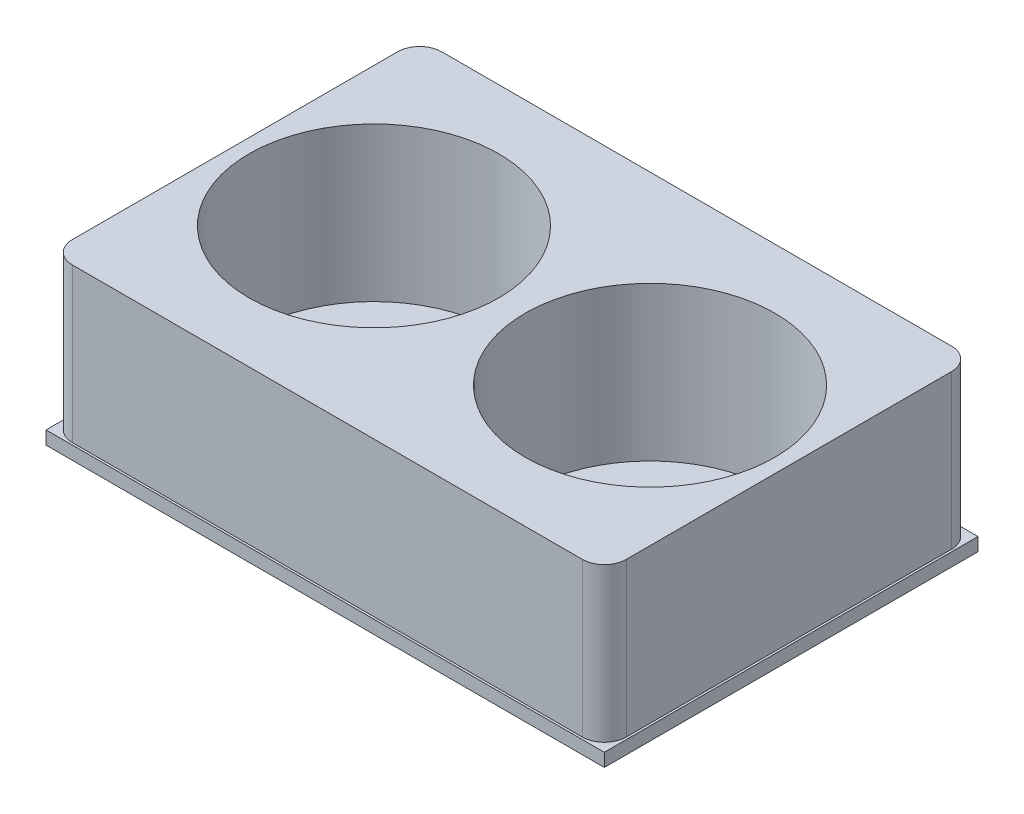
ISO-10303-21;
HEADER;
FILE_DESCRIPTION(('STEP AP214'),'2;1');
FILE_NAME('part.step','',(''),(''),'','','');
FILE_SCHEMA(('AUTOMOTIVE_DESIGN { 1 0 10303 214 1 1 1 1 }'));
ENDSEC;
DATA;
#1=APPLICATION_CONTEXT('core data for automotive mechanical design processes');
#2=APPLICATION_PROTOCOL_DEFINITION('international standard','automotive_design',2000,#1);
#3=PRODUCT_CONTEXT('',#1,'mechanical');
#4=PRODUCT('Part','Part','',(#3));
#5=PRODUCT_RELATED_PRODUCT_CATEGORY('part','',(#4));
#6=PRODUCT_DEFINITION_FORMATION('','',#4);
#7=PRODUCT_DEFINITION_CONTEXT('part definition',#1,'design');
#8=PRODUCT_DEFINITION('design','',#6,#7);
#9=PRODUCT_DEFINITION_SHAPE('','',#8);
#10=(LENGTH_UNIT() NAMED_UNIT(*) SI_UNIT(.MILLI.,.METRE.));
#11=(NAMED_UNIT(*) PLANE_ANGLE_UNIT() SI_UNIT($,.RADIAN.));
#12=(NAMED_UNIT(*) SI_UNIT($,.STERADIAN.) SOLID_ANGLE_UNIT());
#13=UNCERTAINTY_MEASURE_WITH_UNIT(LENGTH_MEASURE(1.E-05),#10,'distance_accuracy_value','');
#14=(GEOMETRIC_REPRESENTATION_CONTEXT(3) GLOBAL_UNCERTAINTY_ASSIGNED_CONTEXT((#13)) GLOBAL_UNIT_ASSIGNED_CONTEXT((#10,
#11,#12)) REPRESENTATION_CONTEXT('',''));
#15=CARTESIAN_POINT('',(0.,0.,0.));
#16=DIRECTION('',(0.,0.,1.));
#17=DIRECTION('',(1.,0.,0.));
#18=AXIS2_PLACEMENT_3D('',#15,#16,#17);
#19=CARTESIAN_POINT('',(0.,35.,0.));
#20=DIRECTION('',(0.,-1.,0.));
#21=DIRECTION('',(0.,0.,-1.));
#22=AXIS2_PLACEMENT_3D('',#19,#20,#21);
#23=PLANE('',#22);
#24=DIRECTION('',(-1.,0.,0.));
#25=VECTOR('',#24,1.);
#26=CARTESIAN_POINT('',(0.,35.,-84.));
#27=LINE('',#26,#25);
#28=CARTESIAN_POINT('',(121.,35.,-84.));
#29=VERTEX_POINT('',#28);
#30=CARTESIAN_POINT('',(5.,35.,-84.));
#31=VERTEX_POINT('',#30);
#32=EDGE_CURVE('E189',#29,#31,#27,.T.);
#33=ORIENTED_EDGE('',*,*,#32,.T.);
#34=CARTESIAN_POINT('',(5.,35.,-79.));
#35=DIRECTION('',(0.,-1.,0.));
#36=DIRECTION('',(0.,0.,-1.));
#37=AXIS2_PLACEMENT_3D('',#34,#35,#36);
#38=CIRCLE('',#37,5.);
#39=CARTESIAN_POINT('',(0.,35.,-79.));
#40=VERTEX_POINT('',#39);
#41=EDGE_CURVE('E217',#31,#40,#38,.F.);
#42=ORIENTED_EDGE('',*,*,#41,.T.);
#43=DIRECTION('',(0.,0.,1.));
#44=VECTOR('',#43,1.);
#45=CARTESIAN_POINT('',(0.,35.,0.));
#46=LINE('',#45,#44);
#47=CARTESIAN_POINT('',(0.,35.,-5.));
#48=VERTEX_POINT('',#47);
#49=EDGE_CURVE('E179',#40,#48,#46,.T.);
#50=ORIENTED_EDGE('',*,*,#49,.T.);
#51=CARTESIAN_POINT('',(5.,35.,-5.));
#52=DIRECTION('',(0.,-1.,0.));
#53=DIRECTION('',(0.,0.,-1.));
#54=AXIS2_PLACEMENT_3D('',#51,#52,#53);
#55=CIRCLE('',#54,5.);
#56=CARTESIAN_POINT('',(5.,35.,0.));
#57=VERTEX_POINT('',#56);
#58=EDGE_CURVE('E211',#48,#57,#55,.F.);
#59=ORIENTED_EDGE('',*,*,#58,.T.);
#60=DIRECTION('',(1.,0.,0.));
#61=VECTOR('',#60,1.);
#62=CARTESIAN_POINT('',(0.,35.,0.));
#63=LINE('',#62,#61);
#64=CARTESIAN_POINT('',(121.,35.,0.));
#65=VERTEX_POINT('',#64);
#66=EDGE_CURVE('E182',#57,#65,#63,.T.);
#67=ORIENTED_EDGE('',*,*,#66,.T.);
#68=CARTESIAN_POINT('',(121.,35.,-5.));
#69=DIRECTION('',(0.,-1.,0.));
#70=DIRECTION('',(0.,0.,-1.));
#71=AXIS2_PLACEMENT_3D('',#68,#69,#70);
#72=CIRCLE('',#71,5.);
#73=CARTESIAN_POINT('',(126.,35.,-5.));
#74=VERTEX_POINT('',#73);
#75=EDGE_CURVE('E213',#65,#74,#72,.F.);
#76=ORIENTED_EDGE('',*,*,#75,.T.);
#77=DIRECTION('',(0.,0.,-1.));
#78=VECTOR('',#77,1.);
#79=CARTESIAN_POINT('',(126.,35.,0.));
#80=LINE('',#79,#78);
#81=CARTESIAN_POINT('',(126.,35.,-79.));
#82=VERTEX_POINT('',#81);
#83=EDGE_CURVE('E186',#74,#82,#80,.T.);
#84=ORIENTED_EDGE('',*,*,#83,.T.);
#85=CARTESIAN_POINT('',(121.,35.,-79.));
#86=DIRECTION('',(0.,-1.,0.));
#87=DIRECTION('',(0.,0.,-1.));
#88=AXIS2_PLACEMENT_3D('',#85,#86,#87);
#89=CIRCLE('',#88,5.);
#90=EDGE_CURVE('E215',#82,#29,#89,.F.);
#91=ORIENTED_EDGE('',*,*,#90,.T.);
#92=EDGE_LOOP('',(#33,#42,#50,#59,#67,#76,#84,#91));
#93=FACE_BOUND('',#92,.T.);
#94=CARTESIAN_POINT('',(31.6,35.,-42.));
#95=DIRECTION('',(0.,1.,0.));
#96=DIRECTION('',(0.,0.,1.));
#97=AXIS2_PLACEMENT_3D('',#94,#95,#96);
#98=CIRCLE('',#97,28.4);
#99=CARTESIAN_POINT('',(31.6,35.,-13.6));
#100=VERTEX_POINT('',#99);
#101=EDGE_CURVE('E173',#100,#100,#98,.T.);
#102=ORIENTED_EDGE('',*,*,#101,.F.);
#103=EDGE_LOOP('',(#102));
#104=FACE_BOUND('',#103,.T.);
#105=CARTESIAN_POINT('',(94.4,35.,-42.));
#106=DIRECTION('',(0.,1.,0.));
#107=DIRECTION('',(0.,0.,1.));
#108=AXIS2_PLACEMENT_3D('',#105,#106,#107);
#109=CIRCLE('',#108,28.4);
#110=CARTESIAN_POINT('',(94.4,35.,-13.6));
#111=VERTEX_POINT('',#110);
#112=EDGE_CURVE('E167',#111,#111,#109,.T.);
#113=ORIENTED_EDGE('',*,*,#112,.F.);
#114=EDGE_LOOP('',(#113));
#115=FACE_BOUND('',#114,.T.);
#116=ADVANCED_FACE('F36',(#93,#104,#115),#23,.F.);
#117=CARTESIAN_POINT('',(0.,35.,0.));
#118=DIRECTION('',(1.,0.,0.));
#119=DIRECTION('',(0.,0.,-1.));
#120=AXIS2_PLACEMENT_3D('',#117,#118,#119);
#121=PLANE('',#120);
#122=ORIENTED_EDGE('',*,*,#49,.F.);
#123=DIRECTION('',(0.,-1.,0.));
#124=VECTOR('',#123,1.);
#125=CARTESIAN_POINT('',(0.,35.,-79.));
#126=LINE('',#125,#124);
#127=CARTESIAN_POINT('',(0.,0.,-79.));
#128=VERTEX_POINT('',#127);
#129=EDGE_CURVE('E203',#40,#128,#126,.T.);
#130=ORIENTED_EDGE('',*,*,#129,.T.);
#131=DIRECTION('',(0.,0.,1.));
#132=VECTOR('',#131,1.);
#133=CARTESIAN_POINT('',(0.,0.,0.));
#134=LINE('',#133,#132);
#135=CARTESIAN_POINT('',(0.,0.,-5.));
#136=VERTEX_POINT('',#135);
#137=EDGE_CURVE('E176',#128,#136,#134,.T.);
#138=ORIENTED_EDGE('',*,*,#137,.T.);
#139=DIRECTION('',(0.,-1.,0.));
#140=VECTOR('',#139,1.);
#141=CARTESIAN_POINT('',(0.,35.,-5.));
#142=LINE('',#141,#140);
#143=EDGE_CURVE('E192',#136,#48,#142,.F.);
#144=ORIENTED_EDGE('',*,*,#143,.T.);
#145=EDGE_LOOP('',(#122,#130,#138,#144));
#146=FACE_BOUND('',#145,.T.);
#147=ADVANCED_FACE('F257',(#146),#121,.F.);
#148=CARTESIAN_POINT('',(0.,35.,0.));
#149=DIRECTION('',(0.,0.,-1.));
#150=DIRECTION('',(-1.,0.,0.));
#151=AXIS2_PLACEMENT_3D('',#148,#149,#150);
#152=PLANE('',#151);
#153=DIRECTION('',(1.,0.,0.));
#154=VECTOR('',#153,1.);
#155=CARTESIAN_POINT('',(0.,0.,0.));
#156=LINE('',#155,#154);
#157=CARTESIAN_POINT('',(5.,0.,0.));
#158=VERTEX_POINT('',#157);
#159=CARTESIAN_POINT('',(121.,0.,0.));
#160=VERTEX_POINT('',#159);
#161=EDGE_CURVE('E195',#158,#160,#156,.T.);
#162=ORIENTED_EDGE('',*,*,#161,.T.);
#163=DIRECTION('',(0.,-1.,0.));
#164=VECTOR('',#163,1.);
#165=CARTESIAN_POINT('',(121.,35.,0.));
#166=LINE('',#165,#164);
#167=EDGE_CURVE('E226',#160,#65,#166,.F.);
#168=ORIENTED_EDGE('',*,*,#167,.T.);
#169=ORIENTED_EDGE('',*,*,#66,.F.);
#170=DIRECTION('',(0.,-1.,0.));
#171=VECTOR('',#170,1.);
#172=CARTESIAN_POINT('',(5.,35.,0.));
#173=LINE('',#172,#171);
#174=EDGE_CURVE('E224',#57,#158,#173,.T.);
#175=ORIENTED_EDGE('',*,*,#174,.T.);
#176=EDGE_LOOP('',(#162,#168,#169,#175));
#177=FACE_BOUND('',#176,.T.);
#178=ADVANCED_FACE('F261',(#177),#152,.F.);
#179=CARTESIAN_POINT('',(126.,35.,0.));
#180=DIRECTION('',(-1.,0.,0.));
#181=DIRECTION('',(0.,0.,1.));
#182=AXIS2_PLACEMENT_3D('',#179,#180,#181);
#183=PLANE('',#182);
#184=DIRECTION('',(0.,0.,-1.));
#185=VECTOR('',#184,1.);
#186=CARTESIAN_POINT('',(126.,0.,0.));
#187=LINE('',#186,#185);
#188=CARTESIAN_POINT('',(126.,0.,-5.));
#189=VERTEX_POINT('',#188);
#190=CARTESIAN_POINT('',(126.,0.,-79.));
#191=VERTEX_POINT('',#190);
#192=EDGE_CURVE('E197',#189,#191,#187,.T.);
#193=ORIENTED_EDGE('',*,*,#192,.T.);
#194=DIRECTION('',(0.,-1.,0.));
#195=VECTOR('',#194,1.);
#196=CARTESIAN_POINT('',(126.,35.,-79.));
#197=LINE('',#196,#195);
#198=EDGE_CURVE('E222',#191,#82,#197,.F.);
#199=ORIENTED_EDGE('',*,*,#198,.T.);
#200=ORIENTED_EDGE('',*,*,#83,.F.);
#201=DIRECTION('',(0.,-1.,0.));
#202=VECTOR('',#201,1.);
#203=CARTESIAN_POINT('',(126.,35.,-5.));
#204=LINE('',#203,#202);
#205=EDGE_CURVE('E219',#74,#189,#204,.T.);
#206=ORIENTED_EDGE('',*,*,#205,.T.);
#207=EDGE_LOOP('',(#193,#199,#200,#206));
#208=FACE_BOUND('',#207,.T.);
#209=ADVANCED_FACE('F239',(#208),#183,.F.);
#210=CARTESIAN_POINT('',(0.,35.,-84.));
#211=DIRECTION('',(0.,0.,1.));
#212=DIRECTION('',(1.,0.,0.));
#213=AXIS2_PLACEMENT_3D('',#210,#211,#212);
#214=PLANE('',#213);
#215=DIRECTION('',(-1.,0.,0.));
#216=VECTOR('',#215,1.);
#217=CARTESIAN_POINT('',(0.,0.,-84.));
#218=LINE('',#217,#216);
#219=CARTESIAN_POINT('',(121.,0.,-84.));
#220=VERTEX_POINT('',#219);
#221=CARTESIAN_POINT('',(5.,0.,-84.));
#222=VERTEX_POINT('',#221);
#223=EDGE_CURVE('E183',#220,#222,#218,.T.);
#224=ORIENTED_EDGE('',*,*,#223,.T.);
#225=DIRECTION('',(0.,-1.,0.));
#226=VECTOR('',#225,1.);
#227=CARTESIAN_POINT('',(5.,35.,-84.));
#228=LINE('',#227,#226);
#229=EDGE_CURVE('E209',#222,#31,#228,.F.);
#230=ORIENTED_EDGE('',*,*,#229,.T.);
#231=ORIENTED_EDGE('',*,*,#32,.F.);
#232=DIRECTION('',(0.,-1.,0.));
#233=VECTOR('',#232,1.);
#234=CARTESIAN_POINT('',(121.,35.,-84.));
#235=LINE('',#234,#233);
#236=EDGE_CURVE('E206',#29,#220,#235,.T.);
#237=ORIENTED_EDGE('',*,*,#236,.T.);
#238=EDGE_LOOP('',(#224,#230,#231,#237));
#239=FACE_BOUND('',#238,.T.);
#240=ADVANCED_FACE('F249',(#239),#214,.F.);
#241=CARTESIAN_POINT('',(31.6,35.,-42.));
#242=DIRECTION('',(0.,-1.,0.));
#243=DIRECTION('',(0.,0.,-1.));
#244=AXIS2_PLACEMENT_3D('',#241,#242,#243);
#245=CYLINDRICAL_SURFACE('',#244,28.4);
#246=ORIENTED_EDGE('',*,*,#101,.T.);
#247=EDGE_LOOP('',(#246));
#248=FACE_BOUND('',#247,.T.);
#249=CARTESIAN_POINT('',(31.6,0.,-42.));
#250=DIRECTION('',(0.,1.,0.));
#251=DIRECTION('',(0.,0.,1.));
#252=AXIS2_PLACEMENT_3D('',#249,#250,#251);
#253=CIRCLE('',#252,28.4);
#254=CARTESIAN_POINT('',(31.6,0.,-13.6));
#255=VERTEX_POINT('',#254);
#256=EDGE_CURVE('E170',#255,#255,#253,.T.);
#257=ORIENTED_EDGE('',*,*,#256,.F.);
#258=EDGE_LOOP('',(#257));
#259=FACE_BOUND('',#258,.T.);
#260=ADVANCED_FACE('F279',(#248,#259),#245,.F.);
#261=CARTESIAN_POINT('',(94.4,35.,-42.));
#262=DIRECTION('',(0.,-1.,0.));
#263=DIRECTION('',(0.,0.,-1.));
#264=AXIS2_PLACEMENT_3D('',#261,#262,#263);
#265=CYLINDRICAL_SURFACE('',#264,28.4);
#266=ORIENTED_EDGE('',*,*,#112,.T.);
#267=EDGE_LOOP('',(#266));
#268=FACE_BOUND('',#267,.T.);
#269=CARTESIAN_POINT('',(94.4,0.,-42.));
#270=DIRECTION('',(0.,1.,0.));
#271=DIRECTION('',(0.,0.,1.));
#272=AXIS2_PLACEMENT_3D('',#269,#270,#271);
#273=CIRCLE('',#272,28.4);
#274=CARTESIAN_POINT('',(94.4,0.,-13.6));
#275=VERTEX_POINT('',#274);
#276=EDGE_CURVE('E163',#275,#275,#273,.T.);
#277=ORIENTED_EDGE('',*,*,#276,.F.);
#278=EDGE_LOOP('',(#277));
#279=FACE_BOUND('',#278,.T.);
#280=ADVANCED_FACE('F303',(#268,#279),#265,.F.);
#281=CARTESIAN_POINT('',(0.,0.,0.));
#282=DIRECTION('',(0.,-1.,0.));
#283=DIRECTION('',(0.,0.,-1.));
#284=AXIS2_PLACEMENT_3D('',#281,#282,#283);
#285=PLANE('',#284);
#286=ORIENTED_EDGE('',*,*,#276,.T.);
#287=EDGE_LOOP('',(#286));
#288=FACE_BOUND('',#287,.T.);
#289=ADVANCED_FACE('F294',(#288),#285,.F.);
#290=ORIENTED_EDGE('',*,*,#137,.F.);
#291=CARTESIAN_POINT('',(5.,0.,-79.));
#292=DIRECTION('',(0.,-1.,0.));
#293=DIRECTION('',(0.,0.,-1.));
#294=AXIS2_PLACEMENT_3D('',#291,#292,#293);
#295=CIRCLE('',#294,5.);
#296=EDGE_CURVE('E228',#128,#222,#295,.T.);
#297=ORIENTED_EDGE('',*,*,#296,.T.);
#298=ORIENTED_EDGE('',*,*,#223,.F.);
#299=CARTESIAN_POINT('',(121.,0.,-79.));
#300=DIRECTION('',(0.,-1.,0.));
#301=DIRECTION('',(0.,0.,-1.));
#302=AXIS2_PLACEMENT_3D('',#299,#300,#301);
#303=CIRCLE('',#302,5.);
#304=EDGE_CURVE('E230',#220,#191,#303,.T.);
#305=ORIENTED_EDGE('',*,*,#304,.T.);
#306=ORIENTED_EDGE('',*,*,#192,.F.);
#307=CARTESIAN_POINT('',(121.,0.,-5.));
#308=DIRECTION('',(0.,-1.,0.));
#309=DIRECTION('',(0.,0.,-1.));
#310=AXIS2_PLACEMENT_3D('',#307,#308,#309);
#311=CIRCLE('',#310,5.);
#312=EDGE_CURVE('E44',#189,#160,#311,.T.);
#313=ORIENTED_EDGE('',*,*,#312,.T.);
#314=ORIENTED_EDGE('',*,*,#161,.F.);
#315=CARTESIAN_POINT('',(5.,0.,-5.));
#316=DIRECTION('',(0.,-1.,0.));
#317=DIRECTION('',(0.,0.,-1.));
#318=AXIS2_PLACEMENT_3D('',#315,#316,#317);
#319=CIRCLE('',#318,5.);
#320=EDGE_CURVE('E11',#158,#136,#319,.T.);
#321=ORIENTED_EDGE('',*,*,#320,.T.);
#322=EDGE_LOOP('',(#290,#297,#298,#305,#306,#313,#314,#321));
#323=FACE_BOUND('',#322,.T.);
#324=DIRECTION('',(1.,0.,0.));
#325=VECTOR('',#324,1.);
#326=CARTESIAN_POINT('',(-0.499999999999987,0.,0.5));
#327=LINE('',#326,#325);
#328=CARTESIAN_POINT('',(-0.499999999999987,0.,0.5));
#329=VERTEX_POINT('',#328);
#330=CARTESIAN_POINT('',(126.5,0.,0.5));
#331=VERTEX_POINT('',#330);
#332=EDGE_CURVE('E158',#329,#331,#327,.T.);
#333=ORIENTED_EDGE('',*,*,#332,.T.);
#334=DIRECTION('',(0.,0.,1.));
#335=VECTOR('',#334,1.);
#336=CARTESIAN_POINT('',(126.5,0.,-84.5));
#337=LINE('',#336,#335);
#338=CARTESIAN_POINT('',(126.5,0.,-84.5));
#339=VERTEX_POINT('',#338);
#340=EDGE_CURVE('E141',#339,#331,#337,.T.);
#341=ORIENTED_EDGE('',*,*,#340,.F.);
#342=DIRECTION('',(1.,0.,0.));
#343=VECTOR('',#342,1.);
#344=CARTESIAN_POINT('',(-0.499999999999987,0.,-84.5));
#345=LINE('',#344,#343);
#346=CARTESIAN_POINT('',(-0.499999999999987,0.,-84.5));
#347=VERTEX_POINT('',#346);
#348=EDGE_CURVE('E153',#347,#339,#345,.T.);
#349=ORIENTED_EDGE('',*,*,#348,.F.);
#350=DIRECTION('',(0.,0.,1.));
#351=VECTOR('',#350,1.);
#352=CARTESIAN_POINT('',(-0.499999999999987,0.,-84.5));
#353=LINE('',#352,#351);
#354=EDGE_CURVE('E150',#347,#329,#353,.T.);
#355=ORIENTED_EDGE('',*,*,#354,.T.);
#356=EDGE_LOOP('',(#333,#341,#349,#355));
#357=FACE_BOUND('',#356,.T.);
#358=ADVANCED_FACE('F233',(#323,#357),#285,.F.);
#359=CARTESIAN_POINT('',(0.,-3.,0.));
#360=DIRECTION('',(0.,-1.,0.));
#361=DIRECTION('',(0.,0.,-1.));
#362=AXIS2_PLACEMENT_3D('',#359,#360,#361);
#363=PLANE('',#362);
#364=DIRECTION('',(1.,0.,0.));
#365=VECTOR('',#364,1.);
#366=CARTESIAN_POINT('',(-0.499999999999987,-3.,0.5));
#367=LINE('',#366,#365);
#368=CARTESIAN_POINT('',(-0.499999999999987,-3.,0.5));
#369=VERTEX_POINT('',#368);
#370=CARTESIAN_POINT('',(126.5,-3.,0.5));
#371=VERTEX_POINT('',#370);
#372=EDGE_CURVE('E129',#369,#371,#367,.T.);
#373=ORIENTED_EDGE('',*,*,#372,.F.);
#374=DIRECTION('',(0.,0.,1.));
#375=VECTOR('',#374,1.);
#376=CARTESIAN_POINT('',(-0.499999999999987,-3.,-84.5));
#377=LINE('',#376,#375);
#378=CARTESIAN_POINT('',(-0.499999999999987,-3.,-84.5));
#379=VERTEX_POINT('',#378);
#380=EDGE_CURVE('E146',#379,#369,#377,.T.);
#381=ORIENTED_EDGE('',*,*,#380,.F.);
#382=DIRECTION('',(1.,0.,0.));
#383=VECTOR('',#382,1.);
#384=CARTESIAN_POINT('',(-0.499999999999987,-3.,-84.5));
#385=LINE('',#384,#383);
#386=CARTESIAN_POINT('',(126.5,-3.,-84.5));
#387=VERTEX_POINT('',#386);
#388=EDGE_CURVE('E132',#379,#387,#385,.T.);
#389=ORIENTED_EDGE('',*,*,#388,.T.);
#390=DIRECTION('',(0.,0.,1.));
#391=VECTOR('',#390,1.);
#392=CARTESIAN_POINT('',(126.5,-3.,-84.5));
#393=LINE('',#392,#391);
#394=EDGE_CURVE('E124',#387,#371,#393,.T.);
#395=ORIENTED_EDGE('',*,*,#394,.T.);
#396=EDGE_LOOP('',(#373,#381,#389,#395));
#397=FACE_BOUND('',#396,.T.);
#398=ADVANCED_FACE('F126',(#397),#363,.T.);
#399=CARTESIAN_POINT('',(126.5,-3.,-84.5));
#400=DIRECTION('',(-1.,0.,0.));
#401=DIRECTION('',(0.,0.,1.));
#402=AXIS2_PLACEMENT_3D('',#399,#400,#401);
#403=PLANE('',#402);
#404=ORIENTED_EDGE('',*,*,#340,.T.);
#405=DIRECTION('',(0.,1.,0.));
#406=VECTOR('',#405,1.);
#407=CARTESIAN_POINT('',(126.5,-3.,0.5));
#408=LINE('',#407,#406);
#409=EDGE_CURVE('E138',#371,#331,#408,.T.);
#410=ORIENTED_EDGE('',*,*,#409,.F.);
#411=ORIENTED_EDGE('',*,*,#394,.F.);
#412=DIRECTION('',(0.,1.,0.));
#413=VECTOR('',#412,1.);
#414=CARTESIAN_POINT('',(126.5,-3.,-84.5));
#415=LINE('',#414,#413);
#416=EDGE_CURVE('E145',#387,#339,#415,.T.);
#417=ORIENTED_EDGE('',*,*,#416,.T.);
#418=EDGE_LOOP('',(#404,#410,#411,#417));
#419=FACE_BOUND('',#418,.T.);
#420=ADVANCED_FACE('F139',(#419),#403,.F.);
#421=CARTESIAN_POINT('',(-0.499999999999987,-3.,-84.5));
#422=DIRECTION('',(0.,0.,1.));
#423=DIRECTION('',(1.,0.,0.));
#424=AXIS2_PLACEMENT_3D('',#421,#422,#423);
#425=PLANE('',#424);
#426=ORIENTED_EDGE('',*,*,#348,.T.);
#427=ORIENTED_EDGE('',*,*,#416,.F.);
#428=ORIENTED_EDGE('',*,*,#388,.F.);
#429=DIRECTION('',(0.,1.,0.));
#430=VECTOR('',#429,1.);
#431=CARTESIAN_POINT('',(-0.499999999999987,-3.,-84.5));
#432=LINE('',#431,#430);
#433=EDGE_CURVE('E164',#379,#347,#432,.T.);
#434=ORIENTED_EDGE('',*,*,#433,.T.);
#435=EDGE_LOOP('',(#426,#427,#428,#434));
#436=FACE_BOUND('',#435,.T.);
#437=ADVANCED_FACE('F312',(#436),#425,.F.);
#438=CARTESIAN_POINT('',(-0.499999999999987,-3.,-84.5));
#439=DIRECTION('',(-1.,0.,0.));
#440=DIRECTION('',(0.,0.,1.));
#441=AXIS2_PLACEMENT_3D('',#438,#439,#440);
#442=PLANE('',#441);
#443=ORIENTED_EDGE('',*,*,#354,.F.);
#444=ORIENTED_EDGE('',*,*,#433,.F.);
#445=ORIENTED_EDGE('',*,*,#380,.T.);
#446=DIRECTION('',(0.,1.,0.));
#447=VECTOR('',#446,1.);
#448=CARTESIAN_POINT('',(-0.499999999999987,-3.,0.5));
#449=LINE('',#448,#447);
#450=EDGE_CURVE('E149',#369,#329,#449,.T.);
#451=ORIENTED_EDGE('',*,*,#450,.T.);
#452=EDGE_LOOP('',(#443,#444,#445,#451));
#453=FACE_BOUND('',#452,.T.);
#454=ADVANCED_FACE('F298',(#453),#442,.T.);
#455=CARTESIAN_POINT('',(-0.499999999999987,-3.,0.5));
#456=DIRECTION('',(0.,0.,1.));
#457=DIRECTION('',(1.,0.,0.));
#458=AXIS2_PLACEMENT_3D('',#455,#456,#457);
#459=PLANE('',#458);
#460=ORIENTED_EDGE('',*,*,#332,.F.);
#461=ORIENTED_EDGE('',*,*,#450,.F.);
#462=ORIENTED_EDGE('',*,*,#372,.T.);
#463=ORIENTED_EDGE('',*,*,#409,.T.);
#464=EDGE_LOOP('',(#460,#461,#462,#463));
#465=FACE_BOUND('',#464,.T.);
#466=ADVANCED_FACE('F148',(#465),#459,.T.);
#467=ORIENTED_EDGE('',*,*,#256,.T.);
#468=EDGE_LOOP('',(#467));
#469=FACE_BOUND('',#468,.T.);
#470=ADVANCED_FACE('F288',(#469),#285,.F.);
#471=CARTESIAN_POINT('',(5.,35.,-79.));
#472=DIRECTION('',(0.,-1.,0.));
#473=DIRECTION('',(0.,0.,-1.));
#474=AXIS2_PLACEMENT_3D('',#471,#472,#473);
#475=CYLINDRICAL_SURFACE('',#474,5.);
#476=ORIENTED_EDGE('',*,*,#41,.F.);
#477=ORIENTED_EDGE('',*,*,#229,.F.);
#478=ORIENTED_EDGE('',*,*,#296,.F.);
#479=ORIENTED_EDGE('',*,*,#129,.F.);
#480=EDGE_LOOP('',(#476,#477,#478,#479));
#481=FACE_BOUND('',#480,.T.);
#482=ADVANCED_FACE('F252',(#481),#475,.T.);
#483=CARTESIAN_POINT('',(121.,35.,-79.));
#484=DIRECTION('',(0.,-1.,0.));
#485=DIRECTION('',(0.,0.,-1.));
#486=AXIS2_PLACEMENT_3D('',#483,#484,#485);
#487=CYLINDRICAL_SURFACE('',#486,5.);
#488=ORIENTED_EDGE('',*,*,#90,.F.);
#489=ORIENTED_EDGE('',*,*,#198,.F.);
#490=ORIENTED_EDGE('',*,*,#304,.F.);
#491=ORIENTED_EDGE('',*,*,#236,.F.);
#492=EDGE_LOOP('',(#488,#489,#490,#491));
#493=FACE_BOUND('',#492,.T.);
#494=ADVANCED_FACE('F243',(#493),#487,.T.);
#495=CARTESIAN_POINT('',(121.,35.,-5.));
#496=DIRECTION('',(0.,-1.,0.));
#497=DIRECTION('',(0.,0.,-1.));
#498=AXIS2_PLACEMENT_3D('',#495,#496,#497);
#499=CYLINDRICAL_SURFACE('',#498,5.);
#500=ORIENTED_EDGE('',*,*,#75,.F.);
#501=ORIENTED_EDGE('',*,*,#167,.F.);
#502=ORIENTED_EDGE('',*,*,#312,.F.);
#503=ORIENTED_EDGE('',*,*,#205,.F.);
#504=EDGE_LOOP('',(#500,#501,#502,#503));
#505=FACE_BOUND('',#504,.T.);
#506=ADVANCED_FACE('F264',(#505),#499,.T.);
#507=CARTESIAN_POINT('',(5.,35.,-5.));
#508=DIRECTION('',(0.,-1.,0.));
#509=DIRECTION('',(0.,0.,-1.));
#510=AXIS2_PLACEMENT_3D('',#507,#508,#509);
#511=CYLINDRICAL_SURFACE('',#510,5.);
#512=ORIENTED_EDGE('',*,*,#58,.F.);
#513=ORIENTED_EDGE('',*,*,#143,.F.);
#514=ORIENTED_EDGE('',*,*,#320,.F.);
#515=ORIENTED_EDGE('',*,*,#174,.F.);
#516=EDGE_LOOP('',(#512,#513,#514,#515));
#517=FACE_BOUND('',#516,.T.);
#518=ADVANCED_FACE('F38',(#517),#511,.T.);
#519=CLOSED_SHELL('',(#116,#147,#178,#209,#240,#260,#280,#289,#358,#398,#420,#437,#454,#466,
#470,#482,#494,#506,#518));
#520=MANIFOLD_SOLID_BREP('B2',#519);
#521=ADVANCED_BREP_SHAPE_REPRESENTATION('',(#18,#520),#14);
#522=SHAPE_DEFINITION_REPRESENTATION(#9,#521);
ENDSEC;
END-ISO-10303-21;
